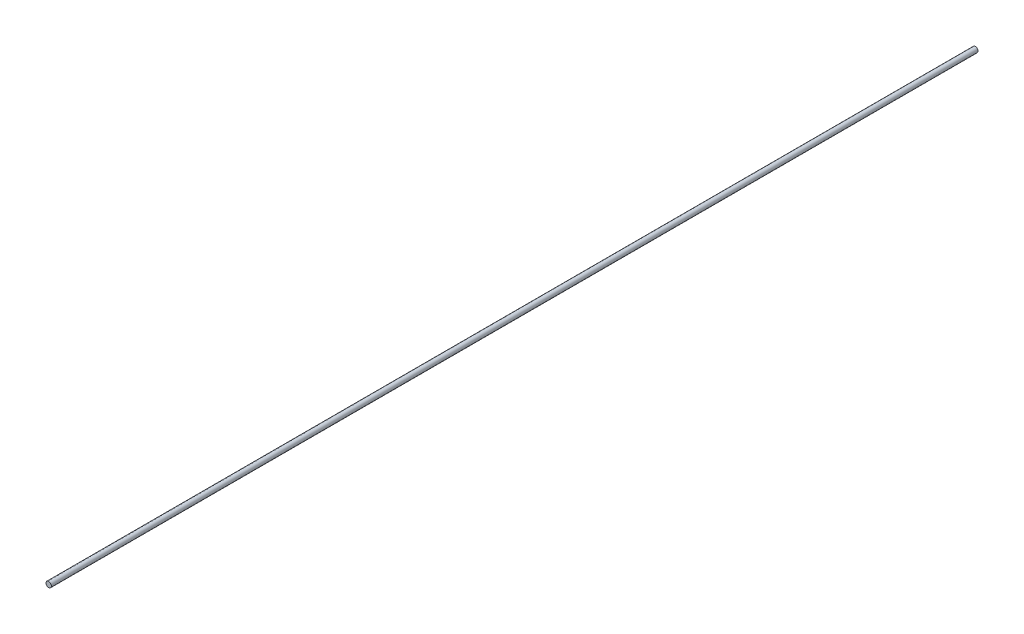
ISO-10303-21;
HEADER;
FILE_DESCRIPTION(('STEP AP214'),'2;1');
FILE_NAME('part.step','',(''),(''),'','','');
FILE_SCHEMA(('AUTOMOTIVE_DESIGN { 1 0 10303 214 1 1 1 1 }'));
ENDSEC;
DATA;
#1=APPLICATION_CONTEXT('core data for automotive mechanical design processes');
#2=APPLICATION_PROTOCOL_DEFINITION('international standard','automotive_design',2000,#1);
#3=PRODUCT_CONTEXT('',#1,'mechanical');
#4=PRODUCT('Part','Part','',(#3));
#5=PRODUCT_RELATED_PRODUCT_CATEGORY('part','',(#4));
#6=PRODUCT_DEFINITION_FORMATION('','',#4);
#7=PRODUCT_DEFINITION_CONTEXT('part definition',#1,'design');
#8=PRODUCT_DEFINITION('design','',#6,#7);
#9=PRODUCT_DEFINITION_SHAPE('','',#8);
#10=(LENGTH_UNIT() NAMED_UNIT(*) SI_UNIT(.MILLI.,.METRE.));
#11=(NAMED_UNIT(*) PLANE_ANGLE_UNIT() SI_UNIT($,.RADIAN.));
#12=(NAMED_UNIT(*) SI_UNIT($,.STERADIAN.) SOLID_ANGLE_UNIT());
#13=UNCERTAINTY_MEASURE_WITH_UNIT(LENGTH_MEASURE(1.E-05),#10,'distance_accuracy_value','');
#14=(GEOMETRIC_REPRESENTATION_CONTEXT(3) GLOBAL_UNCERTAINTY_ASSIGNED_CONTEXT((#13)) GLOBAL_UNIT_ASSIGNED_CONTEXT((#10,
#11,#12)) REPRESENTATION_CONTEXT('',''));
#15=CARTESIAN_POINT('',(0.,0.,0.));
#16=DIRECTION('',(0.,0.,1.));
#17=DIRECTION('',(1.,0.,0.));
#18=AXIS2_PLACEMENT_3D('',#15,#16,#17);
#19=CARTESIAN_POINT('',(0.,0.,1100.));
#20=DIRECTION('',(0.,0.,-1.));
#21=DIRECTION('',(-1.,0.,0.));
#22=AXIS2_PLACEMENT_3D('',#19,#20,#21);
#23=CYLINDRICAL_SURFACE('',#22,3.175);
#24=CARTESIAN_POINT('',(0.,0.,1100.));
#25=DIRECTION('',(0.,0.,1.));
#26=DIRECTION('',(1.,0.,0.));
#27=AXIS2_PLACEMENT_3D('',#24,#25,#26);
#28=CIRCLE('',#27,3.175);
#29=CARTESIAN_POINT('',(3.175,0.,1100.));
#30=VERTEX_POINT('',#29);
#31=EDGE_CURVE('E10',#30,#30,#28,.T.);
#32=ORIENTED_EDGE('',*,*,#31,.F.);
#33=EDGE_LOOP('',(#32));
#34=FACE_BOUND('',#33,.T.);
#35=CARTESIAN_POINT('',(0.,0.,0.));
#36=DIRECTION('',(0.,0.,1.));
#37=DIRECTION('',(1.,0.,0.));
#38=AXIS2_PLACEMENT_3D('',#35,#36,#37);
#39=CIRCLE('',#38,3.175);
#40=CARTESIAN_POINT('',(3.175,0.,0.));
#41=VERTEX_POINT('',#40);
#42=EDGE_CURVE('E17',#41,#41,#39,.T.);
#43=ORIENTED_EDGE('',*,*,#42,.T.);
#44=EDGE_LOOP('',(#43));
#45=FACE_BOUND('',#44,.T.);
#46=ADVANCED_FACE('F14',(#34,#45),#23,.T.);
#47=CARTESIAN_POINT('',(0.,0.,1100.));
#48=DIRECTION('',(0.,0.,1.));
#49=DIRECTION('',(1.,0.,0.));
#50=AXIS2_PLACEMENT_3D('',#47,#48,#49);
#51=PLANE('',#50);
#52=ORIENTED_EDGE('',*,*,#31,.T.);
#53=EDGE_LOOP('',(#52));
#54=FACE_BOUND('',#53,.T.);
#55=ADVANCED_FACE('F29',(#54),#51,.T.);
#56=CARTESIAN_POINT('',(0.,0.,0.));
#57=DIRECTION('',(0.,0.,1.));
#58=DIRECTION('',(1.,0.,0.));
#59=AXIS2_PLACEMENT_3D('',#56,#57,#58);
#60=PLANE('',#59);
#61=ORIENTED_EDGE('',*,*,#42,.F.);
#62=EDGE_LOOP('',(#61));
#63=FACE_BOUND('',#62,.T.);
#64=ADVANCED_FACE('F27',(#63),#60,.F.);
#65=CLOSED_SHELL('',(#46,#55,#64));
#66=MANIFOLD_SOLID_BREP('B1',#65);
#67=ADVANCED_BREP_SHAPE_REPRESENTATION('',(#18,#66),#14);
#68=SHAPE_DEFINITION_REPRESENTATION(#9,#67);
ENDSEC;
END-ISO-10303-21;
